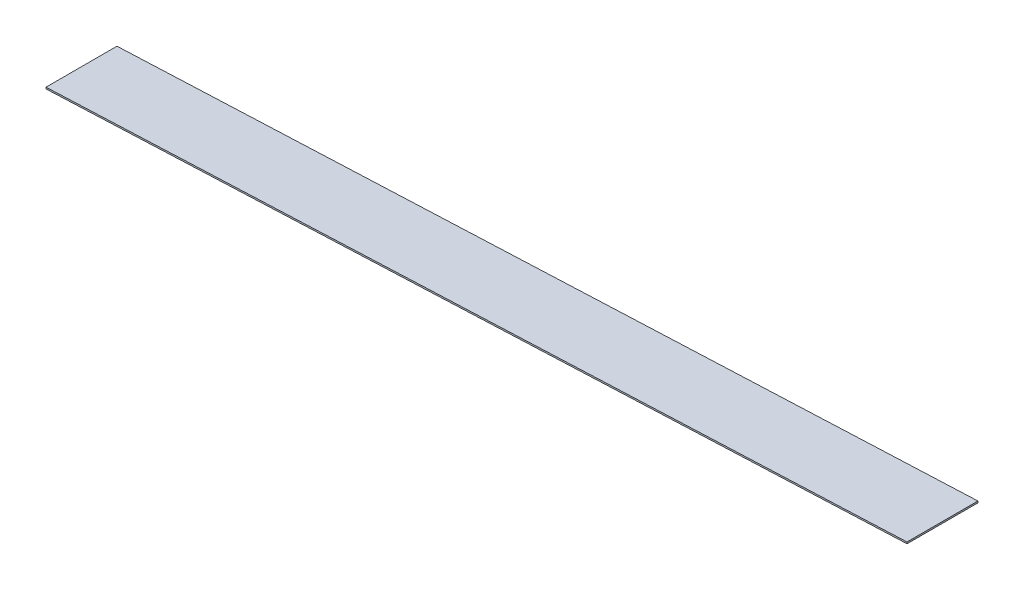
ISO-10303-21;
HEADER;
FILE_DESCRIPTION(('STEP AP214'),'2;1');
FILE_NAME('part.step','',(''),(''),'','','');
FILE_SCHEMA(('AUTOMOTIVE_DESIGN { 1 0 10303 214 1 1 1 1 }'));
ENDSEC;
DATA;
#1=APPLICATION_CONTEXT('core data for automotive mechanical design processes');
#2=APPLICATION_PROTOCOL_DEFINITION('international standard','automotive_design',2000,#1);
#3=PRODUCT_CONTEXT('',#1,'mechanical');
#4=PRODUCT('Part','Part','',(#3));
#5=PRODUCT_RELATED_PRODUCT_CATEGORY('part','',(#4));
#6=PRODUCT_DEFINITION_FORMATION('','',#4);
#7=PRODUCT_DEFINITION_CONTEXT('part definition',#1,'design');
#8=PRODUCT_DEFINITION('design','',#6,#7);
#9=PRODUCT_DEFINITION_SHAPE('','',#8);
#10=(LENGTH_UNIT() NAMED_UNIT(*) SI_UNIT(.MILLI.,.METRE.));
#11=(NAMED_UNIT(*) PLANE_ANGLE_UNIT() SI_UNIT($,.RADIAN.));
#12=(NAMED_UNIT(*) SI_UNIT($,.STERADIAN.) SOLID_ANGLE_UNIT());
#13=UNCERTAINTY_MEASURE_WITH_UNIT(LENGTH_MEASURE(1.E-05),#10,'distance_accuracy_value','');
#14=(GEOMETRIC_REPRESENTATION_CONTEXT(3) GLOBAL_UNCERTAINTY_ASSIGNED_CONTEXT((#13)) GLOBAL_UNIT_ASSIGNED_CONTEXT((#10,
#11,#12)) REPRESENTATION_CONTEXT('',''));
#15=CARTESIAN_POINT('',(0.,0.,0.));
#16=DIRECTION('',(0.,0.,1.));
#17=DIRECTION('',(1.,0.,0.));
#18=AXIS2_PLACEMENT_3D('',#15,#16,#17);
#19=CARTESIAN_POINT('',(-7.39628293963734,173.84273064663,-35.));
#20=DIRECTION('',(0.999096153141553,0.0425073732163067,0.));
#21=DIRECTION('',(0.,0.,1.));
#22=AXIS2_PLACEMENT_3D('',#19,#20,#21);
#23=PLANE('',#22);
#24=DIRECTION('',(0.0425073732163067,-0.999096153141553,0.));
#25=VECTOR('',#24,1.);
#26=CARTESIAN_POINT('',(-7.39628293963734,173.84273064663,10.));
#27=LINE('',#26,#25);
#28=CARTESIAN_POINT('',(-7.43879031285366,174.841826799772,10.));
#29=VERTEX_POINT('',#28);
#30=CARTESIAN_POINT('',(-7.35377556642103,172.843634493489,10.));
#31=VERTEX_POINT('',#30);
#32=EDGE_CURVE('E12',#29,#31,#27,.T.);
#33=ORIENTED_EDGE('',*,*,#32,.F.);
#34=DIRECTION('',(0.,0.,1.));
#35=VECTOR('',#34,1.);
#36=CARTESIAN_POINT('',(-7.43879031285366,174.841826799772,-35.));
#37=LINE('',#36,#35);
#38=CARTESIAN_POINT('',(-7.43879031285366,174.841826799772,-80.));
#39=VERTEX_POINT('',#38);
#40=EDGE_CURVE('E79',#29,#39,#37,.F.);
#41=ORIENTED_EDGE('',*,*,#40,.T.);
#42=DIRECTION('',(0.0425073732163067,-0.999096153141553,0.));
#43=VECTOR('',#42,1.);
#44=CARTESIAN_POINT('',(-7.39628293963734,173.84273064663,-80.));
#45=LINE('',#44,#43);
#46=CARTESIAN_POINT('',(-7.35377556642103,172.843634493489,-80.));
#47=VERTEX_POINT('',#46);
#48=EDGE_CURVE('E51',#39,#47,#45,.T.);
#49=ORIENTED_EDGE('',*,*,#48,.T.);
#50=DIRECTION('',(0.,0.,1.));
#51=VECTOR('',#50,1.);
#52=CARTESIAN_POINT('',(-7.35377556642103,172.843634493489,-35.));
#53=LINE('',#52,#51);
#54=EDGE_CURVE('E81',#31,#47,#53,.F.);
#55=ORIENTED_EDGE('',*,*,#54,.F.);
#56=EDGE_LOOP('',(#33,#41,#49,#55));
#57=FACE_BOUND('',#56,.T.);
#58=ADVANCED_FACE('F41',(#57),#23,.F.);
#59=CARTESIAN_POINT('',(538.696472900707,197.076699179325,-80.));
#60=DIRECTION('',(0.,0.,-1.));
#61=DIRECTION('',(0.999096153141553,0.0425073732163067,0.));
#62=AXIS2_PLACEMENT_3D('',#59,#60,#61);
#63=PLANE('',#62);
#64=ORIENTED_EDGE('',*,*,#48,.F.);
#65=DIRECTION('',(0.999096153141553,0.0425073732163067,0.));
#66=VECTOR('',#65,1.);
#67=CARTESIAN_POINT('',(538.653965527491,198.075795332466,-80.));
#68=LINE('',#67,#66);
#69=CARTESIAN_POINT('',(1084.74672136783,221.309763865161,-80.));
#70=VERTEX_POINT('',#69);
#71=EDGE_CURVE('E93',#39,#70,#68,.T.);
#72=ORIENTED_EDGE('',*,*,#71,.T.);
#73=DIRECTION('',(0.0425073732163067,-0.999096153141553,0.));
#74=VECTOR('',#73,1.);
#75=CARTESIAN_POINT('',(1084.78922874105,220.310667712019,-80.));
#76=LINE('',#75,#74);
#77=CARTESIAN_POINT('',(1084.83173611427,219.311571558878,-80.));
#78=VERTEX_POINT('',#77);
#79=EDGE_CURVE('E102',#70,#78,#76,.T.);
#80=ORIENTED_EDGE('',*,*,#79,.T.);
#81=DIRECTION('',(0.999096153141553,0.0425073732163067,0.));
#82=VECTOR('',#81,1.);
#83=CARTESIAN_POINT('',(538.738980273923,196.077603026183,-80.));
#84=LINE('',#83,#82);
#85=EDGE_CURVE('E97',#47,#78,#84,.T.);
#86=ORIENTED_EDGE('',*,*,#85,.F.);
#87=EDGE_LOOP('',(#64,#72,#80,#86));
#88=FACE_BOUND('',#87,.T.);
#89=ADVANCED_FACE('F110',(#88),#63,.T.);
#90=CARTESIAN_POINT('',(1084.78922874105,220.310667712019,-35.));
#91=DIRECTION('',(0.999096153141553,0.0425073732163067,0.));
#92=DIRECTION('',(0.,0.,1.));
#93=AXIS2_PLACEMENT_3D('',#90,#91,#92);
#94=PLANE('',#93);
#95=ORIENTED_EDGE('',*,*,#79,.F.);
#96=DIRECTION('',(0.,0.,1.));
#97=VECTOR('',#96,1.);
#98=CARTESIAN_POINT('',(1084.74672136783,221.309763865161,-35.));
#99=LINE('',#98,#97);
#100=CARTESIAN_POINT('',(1084.74672136783,221.309763865161,10.));
#101=VERTEX_POINT('',#100);
#102=EDGE_CURVE('E95',#70,#101,#99,.T.);
#103=ORIENTED_EDGE('',*,*,#102,.T.);
#104=DIRECTION('',(0.0425073732163067,-0.999096153141553,0.));
#105=VECTOR('',#104,1.);
#106=CARTESIAN_POINT('',(1084.78922874105,220.310667712019,10.));
#107=LINE('',#106,#105);
#108=CARTESIAN_POINT('',(1084.83173611427,219.311571558878,10.));
#109=VERTEX_POINT('',#108);
#110=EDGE_CURVE('E45',#101,#109,#107,.T.);
#111=ORIENTED_EDGE('',*,*,#110,.T.);
#112=DIRECTION('',(0.,0.,1.));
#113=VECTOR('',#112,1.);
#114=CARTESIAN_POINT('',(1084.83173611427,219.311571558878,-35.));
#115=LINE('',#114,#113);
#116=EDGE_CURVE('E111',#78,#109,#115,.T.);
#117=ORIENTED_EDGE('',*,*,#116,.F.);
#118=EDGE_LOOP('',(#95,#103,#111,#117));
#119=FACE_BOUND('',#118,.T.);
#120=ADVANCED_FACE('F115',(#119),#94,.T.);
#121=CARTESIAN_POINT('',(538.696472900707,197.076699179325,10.));
#122=DIRECTION('',(0.,0.,-1.));
#123=DIRECTION('',(0.999096153141553,0.0425073732163067,0.));
#124=AXIS2_PLACEMENT_3D('',#121,#122,#123);
#125=PLANE('',#124);
#126=DIRECTION('',(0.999096153141553,0.0425073732163067,0.));
#127=VECTOR('',#126,1.);
#128=CARTESIAN_POINT('',(538.653965527491,198.075795332466,10.));
#129=LINE('',#128,#127);
#130=EDGE_CURVE('E91',#101,#29,#129,.F.);
#131=ORIENTED_EDGE('',*,*,#130,.T.);
#132=ORIENTED_EDGE('',*,*,#32,.T.);
#133=DIRECTION('',(0.999096153141553,0.0425073732163067,0.));
#134=VECTOR('',#133,1.);
#135=CARTESIAN_POINT('',(538.738980273923,196.077603026183,10.));
#136=LINE('',#135,#134);
#137=EDGE_CURVE('E109',#109,#31,#136,.F.);
#138=ORIENTED_EDGE('',*,*,#137,.F.);
#139=ORIENTED_EDGE('',*,*,#110,.F.);
#140=EDGE_LOOP('',(#131,#132,#138,#139));
#141=FACE_BOUND('',#140,.T.);
#142=ADVANCED_FACE('F43',(#141),#125,.F.);
#143=CARTESIAN_POINT('',(538.738980273923,196.077603026183,-35.));
#144=DIRECTION('',(0.0425073732163067,-0.999096153141553,0.));
#145=DIRECTION('',(0.999096153141553,0.0425073732163067,0.));
#146=AXIS2_PLACEMENT_3D('',#143,#144,#145);
#147=PLANE('',#146);
#148=ORIENTED_EDGE('',*,*,#116,.T.);
#149=ORIENTED_EDGE('',*,*,#137,.T.);
#150=ORIENTED_EDGE('',*,*,#54,.T.);
#151=ORIENTED_EDGE('',*,*,#85,.T.);
#152=EDGE_LOOP('',(#148,#149,#150,#151));
#153=FACE_BOUND('',#152,.T.);
#154=ADVANCED_FACE('F108',(#153),#147,.T.);
#155=CARTESIAN_POINT('',(538.653965527491,198.075795332466,-35.));
#156=DIRECTION('',(0.0425073732163067,-0.999096153141553,0.));
#157=DIRECTION('',(0.999096153141553,0.0425073732163067,0.));
#158=AXIS2_PLACEMENT_3D('',#155,#156,#157);
#159=PLANE('',#158);
#160=ORIENTED_EDGE('',*,*,#102,.F.);
#161=ORIENTED_EDGE('',*,*,#71,.F.);
#162=ORIENTED_EDGE('',*,*,#40,.F.);
#163=ORIENTED_EDGE('',*,*,#130,.F.);
#164=EDGE_LOOP('',(#160,#161,#162,#163));
#165=FACE_BOUND('',#164,.T.);
#166=ADVANCED_FACE('F90',(#165),#159,.F.);
#167=CLOSED_SHELL('',(#58,#89,#120,#142,#154,#166));
#168=MANIFOLD_SOLID_BREP('B2',#167);
#169=ADVANCED_BREP_SHAPE_REPRESENTATION('',(#18,#168),#14);
#170=SHAPE_DEFINITION_REPRESENTATION(#9,#169);
ENDSEC;
END-ISO-10303-21;
